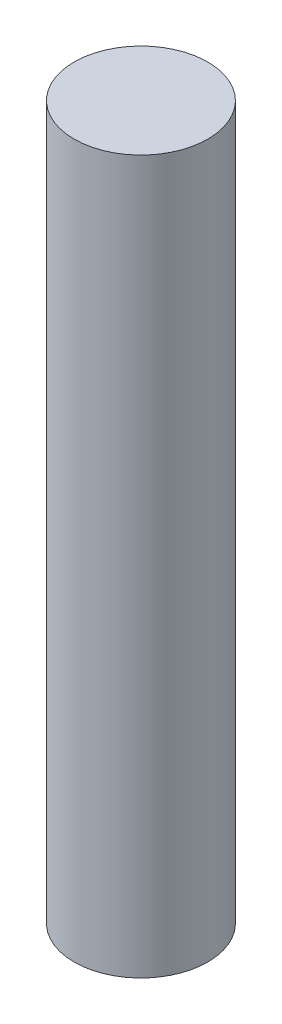
ISO-10303-21;
HEADER;
FILE_DESCRIPTION(('STEP AP214'),'2;1');
FILE_NAME('part.step','',(''),(''),'','','');
FILE_SCHEMA(('AUTOMOTIVE_DESIGN { 1 0 10303 214 1 1 1 1 }'));
ENDSEC;
DATA;
#1=APPLICATION_CONTEXT('core data for automotive mechanical design processes');
#2=APPLICATION_PROTOCOL_DEFINITION('international standard','automotive_design',2000,#1);
#3=PRODUCT_CONTEXT('',#1,'mechanical');
#4=PRODUCT('Part','Part','',(#3));
#5=PRODUCT_RELATED_PRODUCT_CATEGORY('part','',(#4));
#6=PRODUCT_DEFINITION_FORMATION('','',#4);
#7=PRODUCT_DEFINITION_CONTEXT('part definition',#1,'design');
#8=PRODUCT_DEFINITION('design','',#6,#7);
#9=PRODUCT_DEFINITION_SHAPE('','',#8);
#10=(LENGTH_UNIT() NAMED_UNIT(*) SI_UNIT(.MILLI.,.METRE.));
#11=(NAMED_UNIT(*) PLANE_ANGLE_UNIT() SI_UNIT($,.RADIAN.));
#12=(NAMED_UNIT(*) SI_UNIT($,.STERADIAN.) SOLID_ANGLE_UNIT());
#13=UNCERTAINTY_MEASURE_WITH_UNIT(LENGTH_MEASURE(1.E-05),#10,'distance_accuracy_value','');
#14=(GEOMETRIC_REPRESENTATION_CONTEXT(3) GLOBAL_UNCERTAINTY_ASSIGNED_CONTEXT((#13)) GLOBAL_UNIT_ASSIGNED_CONTEXT((#10,
#11,#12)) REPRESENTATION_CONTEXT('',''));
#15=CARTESIAN_POINT('',(0.,0.,0.));
#16=DIRECTION('',(0.,0.,1.));
#17=DIRECTION('',(1.,0.,0.));
#18=AXIS2_PLACEMENT_3D('',#15,#16,#17);
#19=CARTESIAN_POINT('',(0.,50.8,0.));
#20=DIRECTION('',(0.,-1.,0.));
#21=DIRECTION('',(0.,0.,-1.));
#22=AXIS2_PLACEMENT_3D('',#19,#20,#21);
#23=CYLINDRICAL_SURFACE('',#22,4.7625);
#24=CARTESIAN_POINT('',(0.,50.8,0.));
#25=DIRECTION('',(0.,1.,0.));
#26=DIRECTION('',(0.,0.,1.));
#27=AXIS2_PLACEMENT_3D('',#24,#25,#26);
#28=CIRCLE('',#27,4.7625);
#29=CARTESIAN_POINT('',(0.,50.8,4.7625));
#30=VERTEX_POINT('',#29);
#31=EDGE_CURVE('E10',#30,#30,#28,.T.);
#32=ORIENTED_EDGE('',*,*,#31,.F.);
#33=EDGE_LOOP('',(#32));
#34=FACE_BOUND('',#33,.T.);
#35=CARTESIAN_POINT('',(0.,0.,0.));
#36=DIRECTION('',(0.,1.,0.));
#37=DIRECTION('',(0.,0.,1.));
#38=AXIS2_PLACEMENT_3D('',#35,#36,#37);
#39=CIRCLE('',#38,4.7625);
#40=CARTESIAN_POINT('',(0.,0.,4.7625));
#41=VERTEX_POINT('',#40);
#42=EDGE_CURVE('E40',#41,#41,#39,.T.);
#43=ORIENTED_EDGE('',*,*,#42,.T.);
#44=EDGE_LOOP('',(#43));
#45=FACE_BOUND('',#44,.T.);
#46=ADVANCED_FACE('F37',(#34,#45),#23,.T.);
#47=CARTESIAN_POINT('',(0.,50.8,0.));
#48=DIRECTION('',(0.,1.,0.));
#49=DIRECTION('',(0.,0.,1.));
#50=AXIS2_PLACEMENT_3D('',#47,#48,#49);
#51=PLANE('',#50);
#52=ORIENTED_EDGE('',*,*,#31,.T.);
#53=EDGE_LOOP('',(#52));
#54=FACE_BOUND('',#53,.T.);
#55=ADVANCED_FACE('F52',(#54),#51,.T.);
#56=CARTESIAN_POINT('',(0.,0.,0.));
#57=DIRECTION('',(0.,1.,0.));
#58=DIRECTION('',(0.,0.,1.));
#59=AXIS2_PLACEMENT_3D('',#56,#57,#58);
#60=PLANE('',#59);
#61=ORIENTED_EDGE('',*,*,#42,.F.);
#62=EDGE_LOOP('',(#61));
#63=FACE_BOUND('',#62,.T.);
#64=ADVANCED_FACE('F50',(#63),#60,.F.);
#65=CLOSED_SHELL('',(#46,#55,#64));
#66=MANIFOLD_SOLID_BREP('B2',#65);
#67=ADVANCED_BREP_SHAPE_REPRESENTATION('',(#18,#66),#14);
#68=SHAPE_DEFINITION_REPRESENTATION(#9,#67);
ENDSEC;
END-ISO-10303-21;
